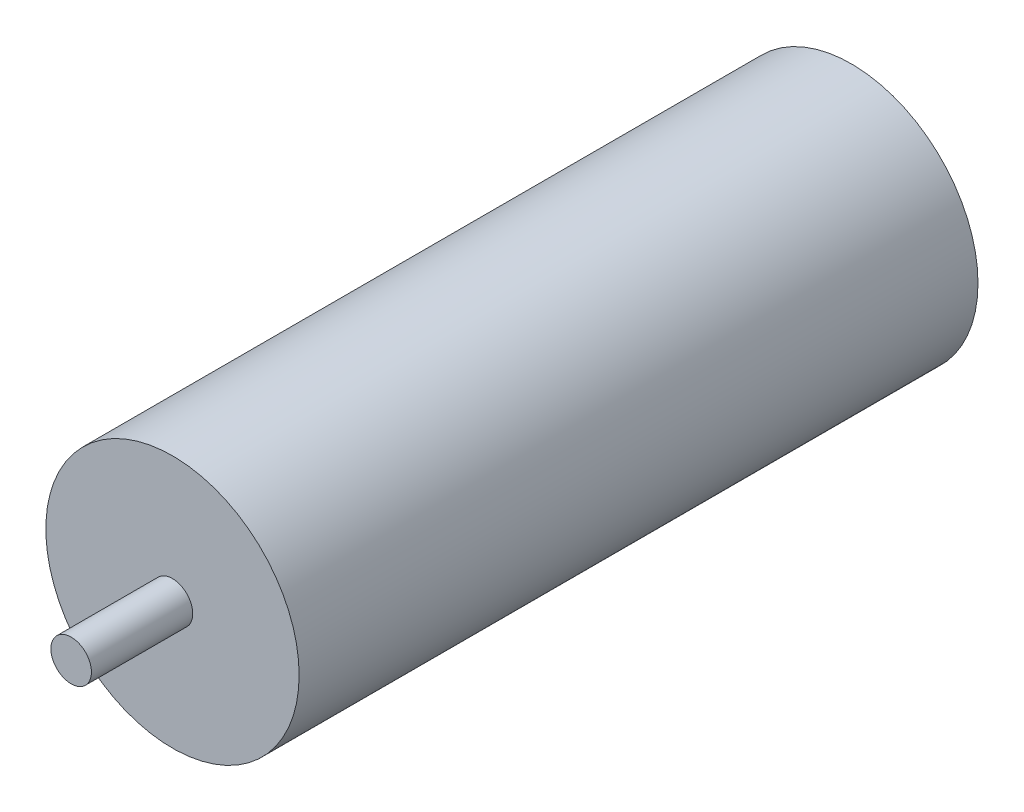
ISO-10303-21;
HEADER;
FILE_DESCRIPTION(('STEP AP214'),'2;1');
FILE_NAME('part.step','',(''),(''),'','','');
FILE_SCHEMA(('AUTOMOTIVE_DESIGN { 1 0 10303 214 1 1 1 1 }'));
ENDSEC;
DATA;
#1=APPLICATION_CONTEXT('core data for automotive mechanical design processes');
#2=APPLICATION_PROTOCOL_DEFINITION('international standard','automotive_design',2000,#1);
#3=PRODUCT_CONTEXT('',#1,'mechanical');
#4=PRODUCT('Part','Part','',(#3));
#5=PRODUCT_RELATED_PRODUCT_CATEGORY('part','',(#4));
#6=PRODUCT_DEFINITION_FORMATION('','',#4);
#7=PRODUCT_DEFINITION_CONTEXT('part definition',#1,'design');
#8=PRODUCT_DEFINITION('design','',#6,#7);
#9=PRODUCT_DEFINITION_SHAPE('','',#8);
#10=(LENGTH_UNIT() NAMED_UNIT(*) SI_UNIT(.MILLI.,.METRE.));
#11=(NAMED_UNIT(*) PLANE_ANGLE_UNIT() SI_UNIT($,.RADIAN.));
#12=(NAMED_UNIT(*) SI_UNIT($,.STERADIAN.) SOLID_ANGLE_UNIT());
#13=UNCERTAINTY_MEASURE_WITH_UNIT(LENGTH_MEASURE(1.E-05),#10,'distance_accuracy_value','');
#14=(GEOMETRIC_REPRESENTATION_CONTEXT(3) GLOBAL_UNCERTAINTY_ASSIGNED_CONTEXT((#13)) GLOBAL_UNIT_ASSIGNED_CONTEXT((#10,
#11,#12)) REPRESENTATION_CONTEXT('',''));
#15=CARTESIAN_POINT('',(0.,0.,0.));
#16=DIRECTION('',(0.,0.,1.));
#17=DIRECTION('',(1.,0.,0.));
#18=AXIS2_PLACEMENT_3D('',#15,#16,#17);
#19=CARTESIAN_POINT('',(0.,0.,77.));
#20=DIRECTION('',(0.,0.,-1.));
#21=DIRECTION('',(-1.,0.,0.));
#22=AXIS2_PLACEMENT_3D('',#19,#20,#21);
#23=CYLINDRICAL_SURFACE('',#22,12.5);
#24=CARTESIAN_POINT('',(0.,0.,0.));
#25=DIRECTION('',(0.,0.,1.));
#26=DIRECTION('',(1.,0.,0.));
#27=AXIS2_PLACEMENT_3D('',#24,#25,#26);
#28=CIRCLE('',#27,12.5);
#29=CARTESIAN_POINT('',(12.5,0.,0.));
#30=VERTEX_POINT('',#29);
#31=EDGE_CURVE('E10',#30,#30,#28,.T.);
#32=ORIENTED_EDGE('',*,*,#31,.T.);
#33=EDGE_LOOP('',(#32));
#34=FACE_BOUND('',#33,.T.);
#35=CARTESIAN_POINT('',(0.,0.,67.));
#36=DIRECTION('',(0.,0.,1.));
#37=DIRECTION('',(1.,0.,0.));
#38=AXIS2_PLACEMENT_3D('',#35,#36,#37);
#39=CIRCLE('',#38,12.5);
#40=CARTESIAN_POINT('',(12.5,0.,67.));
#41=VERTEX_POINT('',#40);
#42=EDGE_CURVE('E40',#41,#41,#39,.T.);
#43=ORIENTED_EDGE('',*,*,#42,.F.);
#44=EDGE_LOOP('',(#43));
#45=FACE_BOUND('',#44,.T.);
#46=ADVANCED_FACE('F37',(#34,#45),#23,.T.);
#47=CARTESIAN_POINT('',(0.,0.,0.));
#48=DIRECTION('',(0.,0.,1.));
#49=DIRECTION('',(1.,0.,0.));
#50=AXIS2_PLACEMENT_3D('',#47,#48,#49);
#51=PLANE('',#50);
#52=ORIENTED_EDGE('',*,*,#31,.F.);
#53=EDGE_LOOP('',(#52));
#54=FACE_BOUND('',#53,.T.);
#55=ADVANCED_FACE('F65',(#54),#51,.F.);
#56=CARTESIAN_POINT('',(0.,0.,67.));
#57=DIRECTION('',(0.,0.,1.));
#58=DIRECTION('',(1.,0.,0.));
#59=AXIS2_PLACEMENT_3D('',#56,#57,#58);
#60=PLANE('',#59);
#61=CARTESIAN_POINT('',(0.,0.,67.));
#62=DIRECTION('',(0.,0.,1.));
#63=DIRECTION('',(1.,0.,0.));
#64=AXIS2_PLACEMENT_3D('',#61,#62,#63);
#65=CIRCLE('',#64,2.);
#66=CARTESIAN_POINT('',(2.,0.,67.));
#67=VERTEX_POINT('',#66);
#68=EDGE_CURVE('E49',#67,#67,#65,.T.);
#69=ORIENTED_EDGE('',*,*,#68,.F.);
#70=EDGE_LOOP('',(#69));
#71=FACE_BOUND('',#70,.T.);
#72=ORIENTED_EDGE('',*,*,#42,.T.);
#73=EDGE_LOOP('',(#72));
#74=FACE_BOUND('',#73,.T.);
#75=ADVANCED_FACE('F62',(#71,#74),#60,.T.);
#76=CARTESIAN_POINT('',(0.,0.,67.));
#77=DIRECTION('',(0.,0.,1.));
#78=DIRECTION('',(1.,0.,0.));
#79=AXIS2_PLACEMENT_3D('',#76,#77,#78);
#80=CYLINDRICAL_SURFACE('',#79,2.);
#81=ORIENTED_EDGE('',*,*,#68,.T.);
#82=EDGE_LOOP('',(#81));
#83=FACE_BOUND('',#82,.T.);
#84=CARTESIAN_POINT('',(0.,0.,77.));
#85=DIRECTION('',(0.,0.,1.));
#86=DIRECTION('',(1.,0.,0.));
#87=AXIS2_PLACEMENT_3D('',#84,#85,#86);
#88=CIRCLE('',#87,2.);
#89=CARTESIAN_POINT('',(2.,0.,77.));
#90=VERTEX_POINT('',#89);
#91=EDGE_CURVE('E51',#90,#90,#88,.T.);
#92=ORIENTED_EDGE('',*,*,#91,.F.);
#93=EDGE_LOOP('',(#92));
#94=FACE_BOUND('',#93,.T.);
#95=ADVANCED_FACE('F59',(#83,#94),#80,.T.);
#96=CARTESIAN_POINT('',(0.,0.,77.));
#97=DIRECTION('',(0.,0.,1.));
#98=DIRECTION('',(1.,0.,0.));
#99=AXIS2_PLACEMENT_3D('',#96,#97,#98);
#100=PLANE('',#99);
#101=ORIENTED_EDGE('',*,*,#91,.T.);
#102=EDGE_LOOP('',(#101));
#103=FACE_BOUND('',#102,.T.);
#104=ADVANCED_FACE('F77',(#103),#100,.T.);
#105=CLOSED_SHELL('',(#46,#55,#75,#95,#104));
#106=MANIFOLD_SOLID_BREP('B2',#105);
#107=ADVANCED_BREP_SHAPE_REPRESENTATION('',(#18,#106),#14);
#108=SHAPE_DEFINITION_REPRESENTATION(#9,#107);
ENDSEC;
END-ISO-10303-21;
